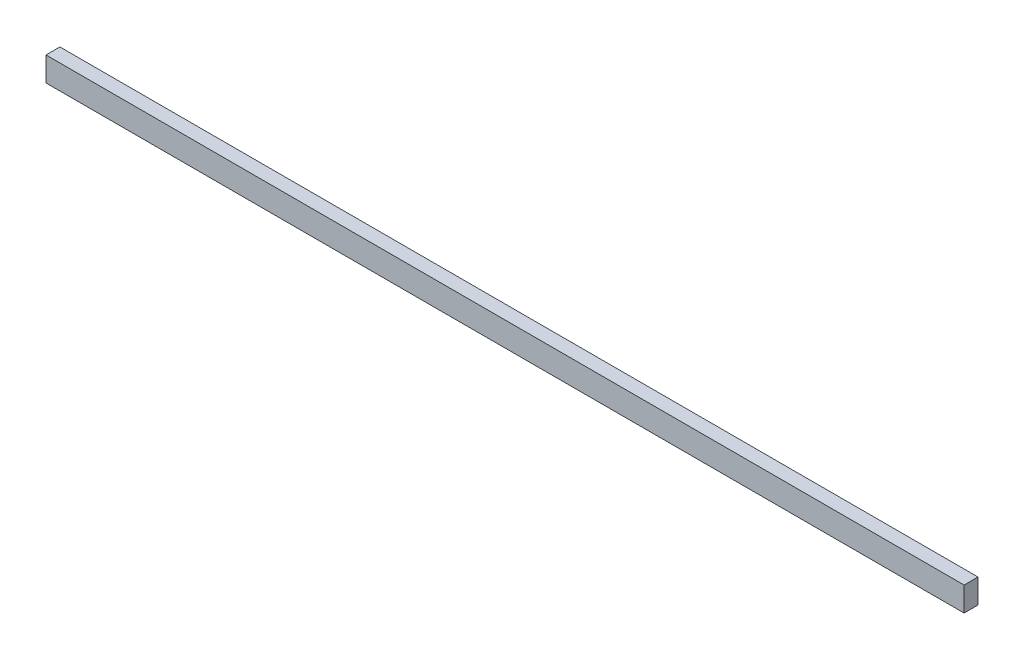
ISO-10303-21;
HEADER;
FILE_DESCRIPTION(('STEP AP214'),'2;1');
FILE_NAME('part.step','',(''),(''),'','','');
FILE_SCHEMA(('AUTOMOTIVE_DESIGN { 1 0 10303 214 1 1 1 1 }'));
ENDSEC;
DATA;
#1=APPLICATION_CONTEXT('core data for automotive mechanical design processes');
#2=APPLICATION_PROTOCOL_DEFINITION('international standard','automotive_design',2000,#1);
#3=PRODUCT_CONTEXT('',#1,'mechanical');
#4=PRODUCT('Part','Part','',(#3));
#5=PRODUCT_RELATED_PRODUCT_CATEGORY('part','',(#4));
#6=PRODUCT_DEFINITION_FORMATION('','',#4);
#7=PRODUCT_DEFINITION_CONTEXT('part definition',#1,'design');
#8=PRODUCT_DEFINITION('design','',#6,#7);
#9=PRODUCT_DEFINITION_SHAPE('','',#8);
#10=(LENGTH_UNIT() NAMED_UNIT(*) SI_UNIT(.MILLI.,.METRE.));
#11=(NAMED_UNIT(*) PLANE_ANGLE_UNIT() SI_UNIT($,.RADIAN.));
#12=(NAMED_UNIT(*) SI_UNIT($,.STERADIAN.) SOLID_ANGLE_UNIT());
#13=UNCERTAINTY_MEASURE_WITH_UNIT(LENGTH_MEASURE(1.E-05),#10,'distance_accuracy_value','');
#14=(GEOMETRIC_REPRESENTATION_CONTEXT(3) GLOBAL_UNCERTAINTY_ASSIGNED_CONTEXT((#13)) GLOBAL_UNIT_ASSIGNED_CONTEXT((#10,
#11,#12)) REPRESENTATION_CONTEXT('',''));
#15=CARTESIAN_POINT('',(0.,0.,0.));
#16=DIRECTION('',(0.,0.,1.));
#17=DIRECTION('',(1.,0.,0.));
#18=AXIS2_PLACEMENT_3D('',#15,#16,#17);
#19=CARTESIAN_POINT('',(-252.705382436261,-22.4036827195467,8.));
#20=DIRECTION('',(1.,0.,0.));
#21=DIRECTION('',(0.,0.,-1.));
#22=AXIS2_PLACEMENT_3D('',#19,#20,#21);
#23=PLANE('',#22);
#24=DIRECTION('',(0.,-1.,0.));
#25=VECTOR('',#24,1.);
#26=CARTESIAN_POINT('',(-252.705382436261,-22.4036827195467,0.));
#27=LINE('',#26,#25);
#28=CARTESIAN_POINT('',(-252.705382436261,-22.4036827195467,0.));
#29=VERTEX_POINT('',#28);
#30=CARTESIAN_POINT('',(-252.705382436261,-36.4036827195467,0.));
#31=VERTEX_POINT('',#30);
#32=EDGE_CURVE('E107',#29,#31,#27,.T.);
#33=ORIENTED_EDGE('',*,*,#32,.T.);
#34=DIRECTION('',(0.,0.,-1.));
#35=VECTOR('',#34,1.);
#36=CARTESIAN_POINT('',(-252.705382436261,-36.4036827195467,8.));
#37=LINE('',#36,#35);
#38=CARTESIAN_POINT('',(-252.705382436261,-36.4036827195467,8.));
#39=VERTEX_POINT('',#38);
#40=EDGE_CURVE('E11',#39,#31,#37,.T.);
#41=ORIENTED_EDGE('',*,*,#40,.F.);
#42=DIRECTION('',(0.,-1.,0.));
#43=VECTOR('',#42,1.);
#44=CARTESIAN_POINT('',(-252.705382436261,-22.4036827195467,8.));
#45=LINE('',#44,#43);
#46=CARTESIAN_POINT('',(-252.705382436261,-22.4036827195467,8.));
#47=VERTEX_POINT('',#46);
#48=EDGE_CURVE('E89',#47,#39,#45,.T.);
#49=ORIENTED_EDGE('',*,*,#48,.F.);
#50=DIRECTION('',(0.,0.,-1.));
#51=VECTOR('',#50,1.);
#52=CARTESIAN_POINT('',(-252.705382436261,-22.4036827195467,8.));
#53=LINE('',#52,#51);
#54=EDGE_CURVE('E56',#47,#29,#53,.T.);
#55=ORIENTED_EDGE('',*,*,#54,.T.);
#56=EDGE_LOOP('',(#33,#41,#49,#55));
#57=FACE_BOUND('',#56,.T.);
#58=ADVANCED_FACE('F39',(#57),#23,.F.);
#59=CARTESIAN_POINT('',(-252.705382436261,-36.4036827195467,8.));
#60=DIRECTION('',(0.,1.,0.));
#61=DIRECTION('',(0.,0.,1.));
#62=AXIS2_PLACEMENT_3D('',#59,#60,#61);
#63=PLANE('',#62);
#64=CARTESIAN_POINT('',(-236.705382436261,-36.4036827195467,4.));
#65=DIRECTION('',(0.,-1.,0.));
#66=DIRECTION('',(0.,0.,-1.));
#67=AXIS2_PLACEMENT_3D('',#64,#65,#66);
#68=CIRCLE('',#67,2.);
#69=CARTESIAN_POINT('',(-236.705382436261,-36.4036827195467,2.));
#70=VERTEX_POINT('',#69);
#71=EDGE_CURVE('E134',#70,#70,#68,.T.);
#72=ORIENTED_EDGE('',*,*,#71,.F.);
#73=EDGE_LOOP('',(#72));
#74=FACE_BOUND('',#73,.T.);
#75=CARTESIAN_POINT('',(260.294617563739,-36.4036827195467,4.));
#76=DIRECTION('',(0.,-1.,0.));
#77=DIRECTION('',(0.,0.,-1.));
#78=AXIS2_PLACEMENT_3D('',#75,#76,#77);
#79=CIRCLE('',#78,2.);
#80=CARTESIAN_POINT('',(260.294617563739,-36.4036827195467,2.));
#81=VERTEX_POINT('',#80);
#82=EDGE_CURVE('E126',#81,#81,#79,.T.);
#83=ORIENTED_EDGE('',*,*,#82,.F.);
#84=EDGE_LOOP('',(#83));
#85=FACE_BOUND('',#84,.T.);
#86=DIRECTION('',(1.,0.,0.));
#87=VECTOR('',#86,1.);
#88=CARTESIAN_POINT('',(-252.705382436261,-36.4036827195467,0.));
#89=LINE('',#88,#87);
#90=CARTESIAN_POINT('',(276.294617563739,-36.4036827195467,0.));
#91=VERTEX_POINT('',#90);
#92=EDGE_CURVE('E95',#31,#91,#89,.T.);
#93=ORIENTED_EDGE('',*,*,#92,.T.);
#94=DIRECTION('',(0.,0.,-1.));
#95=VECTOR('',#94,1.);
#96=CARTESIAN_POINT('',(276.294617563739,-36.4036827195467,8.));
#97=LINE('',#96,#95);
#98=CARTESIAN_POINT('',(276.294617563739,-36.4036827195467,8.));
#99=VERTEX_POINT('',#98);
#100=EDGE_CURVE('E48',#99,#91,#97,.T.);
#101=ORIENTED_EDGE('',*,*,#100,.F.);
#102=DIRECTION('',(1.,0.,0.));
#103=VECTOR('',#102,1.);
#104=CARTESIAN_POINT('',(-252.705382436261,-36.4036827195467,8.));
#105=LINE('',#104,#103);
#106=EDGE_CURVE('E81',#39,#99,#105,.T.);
#107=ORIENTED_EDGE('',*,*,#106,.F.);
#108=ORIENTED_EDGE('',*,*,#40,.T.);
#109=EDGE_LOOP('',(#93,#101,#107,#108));
#110=FACE_BOUND('',#109,.T.);
#111=ADVANCED_FACE('F94',(#74,#85,#110),#63,.F.);
#112=CARTESIAN_POINT('',(276.294617563739,-22.4036827195467,8.));
#113=DIRECTION('',(1.,0.,0.));
#114=DIRECTION('',(0.,0.,-1.));
#115=AXIS2_PLACEMENT_3D('',#112,#113,#114);
#116=PLANE('',#115);
#117=DIRECTION('',(0.,-1.,0.));
#118=VECTOR('',#117,1.);
#119=CARTESIAN_POINT('',(276.294617563739,-22.4036827195467,0.));
#120=LINE('',#119,#118);
#121=CARTESIAN_POINT('',(276.294617563739,-22.4036827195467,0.));
#122=VERTEX_POINT('',#121);
#123=EDGE_CURVE('E113',#122,#91,#120,.T.);
#124=ORIENTED_EDGE('',*,*,#123,.F.);
#125=DIRECTION('',(0.,0.,-1.));
#126=VECTOR('',#125,1.);
#127=CARTESIAN_POINT('',(276.294617563739,-22.4036827195467,8.));
#128=LINE('',#127,#126);
#129=CARTESIAN_POINT('',(276.294617563739,-22.4036827195467,8.));
#130=VERTEX_POINT('',#129);
#131=EDGE_CURVE('E70',#130,#122,#128,.T.);
#132=ORIENTED_EDGE('',*,*,#131,.F.);
#133=DIRECTION('',(0.,-1.,0.));
#134=VECTOR('',#133,1.);
#135=CARTESIAN_POINT('',(276.294617563739,-22.4036827195467,8.));
#136=LINE('',#135,#134);
#137=EDGE_CURVE('E88',#130,#99,#136,.T.);
#138=ORIENTED_EDGE('',*,*,#137,.T.);
#139=ORIENTED_EDGE('',*,*,#100,.T.);
#140=EDGE_LOOP('',(#124,#132,#138,#139));
#141=FACE_BOUND('',#140,.T.);
#142=ADVANCED_FACE('F99',(#141),#116,.T.);
#143=CARTESIAN_POINT('',(-252.705382436261,-22.4036827195467,8.));
#144=DIRECTION('',(0.,1.,0.));
#145=DIRECTION('',(0.,0.,1.));
#146=AXIS2_PLACEMENT_3D('',#143,#144,#145);
#147=PLANE('',#146);
#148=DIRECTION('',(1.,0.,0.));
#149=VECTOR('',#148,1.);
#150=CARTESIAN_POINT('',(-252.705382436261,-22.4036827195467,0.));
#151=LINE('',#150,#149);
#152=EDGE_CURVE('E116',#29,#122,#151,.T.);
#153=ORIENTED_EDGE('',*,*,#152,.F.);
#154=ORIENTED_EDGE('',*,*,#54,.F.);
#155=DIRECTION('',(1.,0.,0.));
#156=VECTOR('',#155,1.);
#157=CARTESIAN_POINT('',(-252.705382436261,-22.4036827195467,8.));
#158=LINE('',#157,#156);
#159=EDGE_CURVE('E101',#47,#130,#158,.T.);
#160=ORIENTED_EDGE('',*,*,#159,.T.);
#161=ORIENTED_EDGE('',*,*,#131,.T.);
#162=EDGE_LOOP('',(#153,#154,#160,#161));
#163=FACE_BOUND('',#162,.T.);
#164=ADVANCED_FACE('F172',(#163),#147,.T.);
#165=CARTESIAN_POINT('',(0.,0.,8.));
#166=DIRECTION('',(0.,0.,1.));
#167=DIRECTION('',(1.,0.,0.));
#168=AXIS2_PLACEMENT_3D('',#165,#166,#167);
#169=PLANE('',#168);
#170=ORIENTED_EDGE('',*,*,#48,.T.);
#171=ORIENTED_EDGE('',*,*,#106,.T.);
#172=ORIENTED_EDGE('',*,*,#137,.F.);
#173=ORIENTED_EDGE('',*,*,#159,.F.);
#174=EDGE_LOOP('',(#170,#171,#172,#173));
#175=FACE_BOUND('',#174,.T.);
#176=ADVANCED_FACE('F85',(#175),#169,.T.);
#177=CARTESIAN_POINT('',(0.,0.,0.));
#178=DIRECTION('',(0.,0.,1.));
#179=DIRECTION('',(1.,0.,0.));
#180=AXIS2_PLACEMENT_3D('',#177,#178,#179);
#181=PLANE('',#180);
#182=ORIENTED_EDGE('',*,*,#32,.F.);
#183=ORIENTED_EDGE('',*,*,#152,.T.);
#184=ORIENTED_EDGE('',*,*,#123,.T.);
#185=ORIENTED_EDGE('',*,*,#92,.F.);
#186=EDGE_LOOP('',(#182,#183,#184,#185));
#187=FACE_BOUND('',#186,.T.);
#188=ADVANCED_FACE('F157',(#187),#181,.F.);
#189=CARTESIAN_POINT('',(260.294617563739,-26.4036827195467,4.));
#190=DIRECTION('',(0.,-1.,0.));
#191=DIRECTION('',(0.,0.,-1.));
#192=AXIS2_PLACEMENT_3D('',#189,#190,#191);
#193=CYLINDRICAL_SURFACE('',#192,2.);
#194=CARTESIAN_POINT('',(260.294617563739,-26.4036827195467,4.));
#195=DIRECTION('',(0.,-1.,0.));
#196=DIRECTION('',(0.,0.,-1.));
#197=AXIS2_PLACEMENT_3D('',#194,#195,#196);
#198=CIRCLE('',#197,2.);
#199=CARTESIAN_POINT('',(260.294617563739,-26.4036827195467,2.));
#200=VERTEX_POINT('',#199);
#201=EDGE_CURVE('E130',#200,#200,#198,.T.);
#202=ORIENTED_EDGE('',*,*,#201,.F.);
#203=EDGE_LOOP('',(#202));
#204=FACE_BOUND('',#203,.T.);
#205=ORIENTED_EDGE('',*,*,#82,.T.);
#206=EDGE_LOOP('',(#205));
#207=FACE_BOUND('',#206,.T.);
#208=ADVANCED_FACE('F155',(#204,#207),#193,.F.);
#209=CARTESIAN_POINT('',(260.294617563739,-26.4036827195467,4.));
#210=DIRECTION('',(0.,-1.,0.));
#211=DIRECTION('',(0.,0.,-1.));
#212=AXIS2_PLACEMENT_3D('',#209,#210,#211);
#213=PLANE('',#212);
#214=ORIENTED_EDGE('',*,*,#201,.T.);
#215=EDGE_LOOP('',(#214));
#216=FACE_BOUND('',#215,.T.);
#217=ADVANCED_FACE('F147',(#216),#213,.T.);
#218=CARTESIAN_POINT('',(-236.705382436261,-26.4036827195467,4.));
#219=DIRECTION('',(0.,-1.,0.));
#220=DIRECTION('',(0.,0.,-1.));
#221=AXIS2_PLACEMENT_3D('',#218,#219,#220);
#222=CYLINDRICAL_SURFACE('',#221,2.);
#223=CARTESIAN_POINT('',(-236.705382436261,-26.4036827195467,4.));
#224=DIRECTION('',(0.,-1.,0.));
#225=DIRECTION('',(0.,0.,-1.));
#226=AXIS2_PLACEMENT_3D('',#223,#224,#225);
#227=CIRCLE('',#226,2.);
#228=CARTESIAN_POINT('',(-236.705382436261,-26.4036827195467,2.));
#229=VERTEX_POINT('',#228);
#230=EDGE_CURVE('E110',#229,#229,#227,.T.);
#231=ORIENTED_EDGE('',*,*,#230,.F.);
#232=EDGE_LOOP('',(#231));
#233=FACE_BOUND('',#232,.T.);
#234=ORIENTED_EDGE('',*,*,#71,.T.);
#235=EDGE_LOOP('',(#234));
#236=FACE_BOUND('',#235,.T.);
#237=ADVANCED_FACE('F144',(#233,#236),#222,.F.);
#238=CARTESIAN_POINT('',(-236.705382436261,-26.4036827195467,4.));
#239=DIRECTION('',(0.,-1.,0.));
#240=DIRECTION('',(0.,0.,-1.));
#241=AXIS2_PLACEMENT_3D('',#238,#239,#240);
#242=PLANE('',#241);
#243=ORIENTED_EDGE('',*,*,#230,.T.);
#244=EDGE_LOOP('',(#243));
#245=FACE_BOUND('',#244,.T.);
#246=ADVANCED_FACE('F142',(#245),#242,.T.);
#247=CLOSED_SHELL('',(#58,#111,#142,#164,#176,#188,#208,#217,#237,#246));
#248=MANIFOLD_SOLID_BREP('B2',#247);
#249=ADVANCED_BREP_SHAPE_REPRESENTATION('',(#18,#248),#14);
#250=SHAPE_DEFINITION_REPRESENTATION(#9,#249);
ENDSEC;
END-ISO-10303-21;
